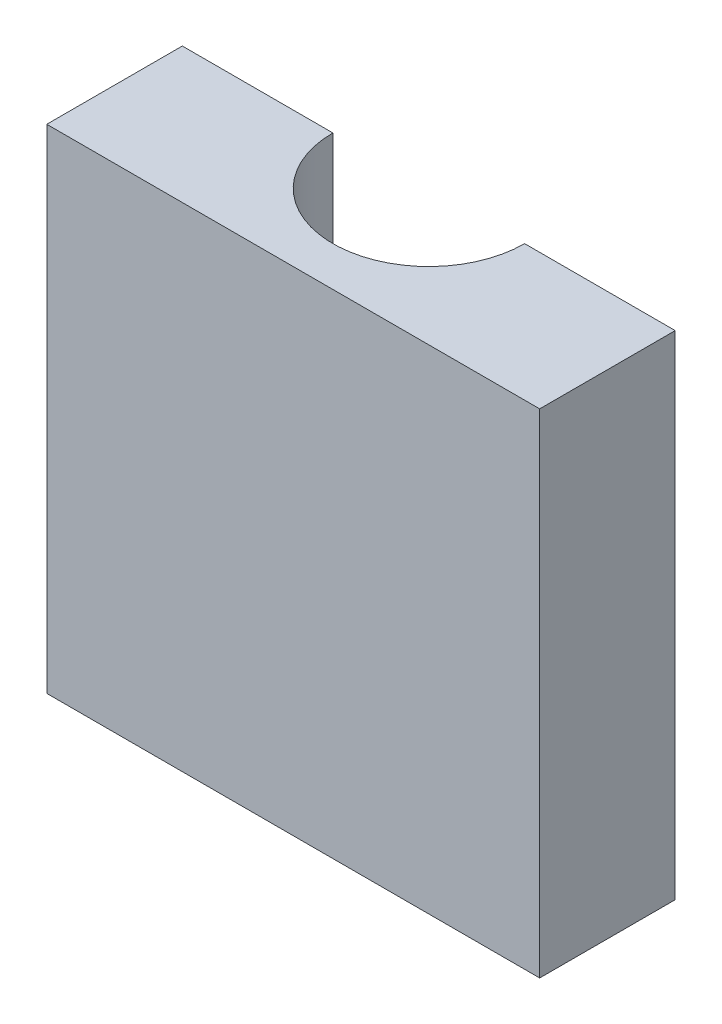
ISO-10303-21;
HEADER;
FILE_DESCRIPTION(('STEP AP214'),'2;1');
FILE_NAME('part.step','',(''),(''),'','','');
FILE_SCHEMA(('AUTOMOTIVE_DESIGN { 1 0 10303 214 1 1 1 1 }'));
ENDSEC;
DATA;
#1=APPLICATION_CONTEXT('core data for automotive mechanical design processes');
#2=APPLICATION_PROTOCOL_DEFINITION('international standard','automotive_design',2000,#1);
#3=PRODUCT_CONTEXT('',#1,'mechanical');
#4=PRODUCT('Part','Part','',(#3));
#5=PRODUCT_RELATED_PRODUCT_CATEGORY('part','',(#4));
#6=PRODUCT_DEFINITION_FORMATION('','',#4);
#7=PRODUCT_DEFINITION_CONTEXT('part definition',#1,'design');
#8=PRODUCT_DEFINITION('design','',#6,#7);
#9=PRODUCT_DEFINITION_SHAPE('','',#8);
#10=(LENGTH_UNIT() NAMED_UNIT(*) SI_UNIT(.MILLI.,.METRE.));
#11=(NAMED_UNIT(*) PLANE_ANGLE_UNIT() SI_UNIT($,.RADIAN.));
#12=(NAMED_UNIT(*) SI_UNIT($,.STERADIAN.) SOLID_ANGLE_UNIT());
#13=UNCERTAINTY_MEASURE_WITH_UNIT(LENGTH_MEASURE(1.E-05),#10,'distance_accuracy_value','');
#14=(GEOMETRIC_REPRESENTATION_CONTEXT(3) GLOBAL_UNCERTAINTY_ASSIGNED_CONTEXT((#13)) GLOBAL_UNIT_ASSIGNED_CONTEXT((#10,
#11,#12)) REPRESENTATION_CONTEXT('',''));
#15=CARTESIAN_POINT('',(0.,0.,0.));
#16=DIRECTION('',(0.,0.,1.));
#17=DIRECTION('',(1.,0.,0.));
#18=AXIS2_PLACEMENT_3D('',#15,#16,#17);
#19=CARTESIAN_POINT('',(25.4,-25.4,13.97));
#20=DIRECTION('',(-1.,0.,0.));
#21=DIRECTION('',(0.,0.,1.));
#22=AXIS2_PLACEMENT_3D('',#19,#20,#21);
#23=PLANE('',#22);
#24=DIRECTION('',(0.,0.,-1.));
#25=VECTOR('',#24,1.);
#26=CARTESIAN_POINT('',(25.4,-25.4,13.97));
#27=LINE('',#26,#25);
#28=CARTESIAN_POINT('',(25.4,-25.4,13.97));
#29=VERTEX_POINT('',#28);
#30=CARTESIAN_POINT('',(25.4,-25.4,0.));
#31=VERTEX_POINT('',#30);
#32=EDGE_CURVE('E236',#29,#31,#27,.T.);
#33=ORIENTED_EDGE('',*,*,#32,.T.);
#34=DIRECTION('',(0.,-1.,0.));
#35=VECTOR('',#34,1.);
#36=CARTESIAN_POINT('',(25.4,0.,0.));
#37=LINE('',#36,#35);
#38=CARTESIAN_POINT('',(25.4,25.4,0.));
#39=VERTEX_POINT('',#38);
#40=EDGE_CURVE('E112',#39,#31,#37,.T.);
#41=ORIENTED_EDGE('',*,*,#40,.F.);
#42=DIRECTION('',(0.,0.,-1.));
#43=VECTOR('',#42,1.);
#44=CARTESIAN_POINT('',(25.4,25.4,13.97));
#45=LINE('',#44,#43);
#46=CARTESIAN_POINT('',(25.4,25.4,13.97));
#47=VERTEX_POINT('',#46);
#48=EDGE_CURVE('E12',#47,#39,#45,.T.);
#49=ORIENTED_EDGE('',*,*,#48,.F.);
#50=DIRECTION('',(0.,1.,0.));
#51=VECTOR('',#50,1.);
#52=CARTESIAN_POINT('',(25.4,-25.4,13.97));
#53=LINE('',#52,#51);
#54=EDGE_CURVE('E183',#29,#47,#53,.T.);
#55=ORIENTED_EDGE('',*,*,#54,.F.);
#56=EDGE_LOOP('',(#33,#41,#49,#55));
#57=FACE_BOUND('',#56,.T.);
#58=ADVANCED_FACE('F45',(#57),#23,.F.);
#59=CARTESIAN_POINT('',(-25.4,25.4,13.97));
#60=DIRECTION('',(0.,-1.,0.));
#61=DIRECTION('',(0.,0.,-1.));
#62=AXIS2_PLACEMENT_3D('',#59,#60,#61);
#63=PLANE('',#62);
#64=ORIENTED_EDGE('',*,*,#48,.T.);
#65=DIRECTION('',(1.,0.,0.));
#66=VECTOR('',#65,1.);
#67=CARTESIAN_POINT('',(0.,25.4,0.));
#68=LINE('',#67,#66);
#69=CARTESIAN_POINT('',(9.8806,25.4,0.));
#70=VERTEX_POINT('',#69);
#71=EDGE_CURVE('E191',#70,#39,#68,.T.);
#72=ORIENTED_EDGE('',*,*,#71,.F.);
#73=CARTESIAN_POINT('',(0.,25.4,0.));
#74=DIRECTION('',(0.,-1.,0.));
#75=DIRECTION('',(0.,0.,-1.));
#76=AXIS2_PLACEMENT_3D('',#73,#74,#75);
#77=CIRCLE('',#76,9.8806);
#78=CARTESIAN_POINT('',(-9.8806,25.4,0.));
#79=VERTEX_POINT('',#78);
#80=EDGE_CURVE('E126',#79,#70,#77,.F.);
#81=ORIENTED_EDGE('',*,*,#80,.F.);
#82=CARTESIAN_POINT('',(-25.4,25.4,0.));
#83=VERTEX_POINT('',#82);
#84=EDGE_CURVE('E62',#83,#79,#68,.T.);
#85=ORIENTED_EDGE('',*,*,#84,.F.);
#86=DIRECTION('',(0.,0.,-1.));
#87=VECTOR('',#86,1.);
#88=CARTESIAN_POINT('',(-25.4,25.4,13.97));
#89=LINE('',#88,#87);
#90=CARTESIAN_POINT('',(-25.4,25.4,13.97));
#91=VERTEX_POINT('',#90);
#92=EDGE_CURVE('E54',#91,#83,#89,.T.);
#93=ORIENTED_EDGE('',*,*,#92,.F.);
#94=DIRECTION('',(-1.,0.,0.));
#95=VECTOR('',#94,1.);
#96=CARTESIAN_POINT('',(-25.4,25.4,13.97));
#97=LINE('',#96,#95);
#98=EDGE_CURVE('E185',#47,#91,#97,.T.);
#99=ORIENTED_EDGE('',*,*,#98,.F.);
#100=EDGE_LOOP('',(#64,#72,#81,#85,#93,#99));
#101=FACE_BOUND('',#100,.T.);
#102=ADVANCED_FACE('F188',(#101),#63,.F.);
#103=CARTESIAN_POINT('',(-25.4,-25.4,13.97));
#104=DIRECTION('',(1.,0.,0.));
#105=DIRECTION('',(0.,0.,-1.));
#106=AXIS2_PLACEMENT_3D('',#103,#104,#105);
#107=PLANE('',#106);
#108=ORIENTED_EDGE('',*,*,#92,.T.);
#109=DIRECTION('',(0.,1.,0.));
#110=VECTOR('',#109,1.);
#111=CARTESIAN_POINT('',(-25.4,0.,0.));
#112=LINE('',#111,#110);
#113=CARTESIAN_POINT('',(-25.4,-25.4,0.));
#114=VERTEX_POINT('',#113);
#115=EDGE_CURVE('E139',#114,#83,#112,.T.);
#116=ORIENTED_EDGE('',*,*,#115,.F.);
#117=DIRECTION('',(0.,0.,-1.));
#118=VECTOR('',#117,1.);
#119=CARTESIAN_POINT('',(-25.4,-25.4,13.97));
#120=LINE('',#119,#118);
#121=CARTESIAN_POINT('',(-25.4,-25.4,13.97));
#122=VERTEX_POINT('',#121);
#123=EDGE_CURVE('E238',#122,#114,#120,.T.);
#124=ORIENTED_EDGE('',*,*,#123,.F.);
#125=DIRECTION('',(0.,-1.,0.));
#126=VECTOR('',#125,1.);
#127=CARTESIAN_POINT('',(-25.4,-25.4,13.97));
#128=LINE('',#127,#126);
#129=EDGE_CURVE('E242',#91,#122,#128,.T.);
#130=ORIENTED_EDGE('',*,*,#129,.F.);
#131=EDGE_LOOP('',(#108,#116,#124,#130));
#132=FACE_BOUND('',#131,.T.);
#133=ADVANCED_FACE('F234',(#132),#107,.F.);
#134=CARTESIAN_POINT('',(-25.4,-25.4,13.97));
#135=DIRECTION('',(0.,1.,0.));
#136=DIRECTION('',(0.,0.,1.));
#137=AXIS2_PLACEMENT_3D('',#134,#135,#136);
#138=PLANE('',#137);
#139=CARTESIAN_POINT('',(0.,-25.4,0.));
#140=DIRECTION('',(0.,1.,0.));
#141=DIRECTION('',(-1.,0.,0.));
#142=AXIS2_PLACEMENT_3D('',#139,#140,#141);
#143=ELLIPSE('',#142,22.098,11.7221);
#144=CARTESIAN_POINT('',(-22.1019589881356,-25.4,-7.46369906238489E-06));
#145=VERTEX_POINT('',#144);
#146=CARTESIAN_POINT('',(22.1019274444897,-25.4,7.32040825024004E-06));
#147=VERTEX_POINT('',#146);
#148=EDGE_CURVE('E48',#145,#147,#143,.T.);
#149=ORIENTED_EDGE('',*,*,#148,.T.);
#150=DIRECTION('',(-1.,0.,0.));
#151=VECTOR('',#150,1.);
#152=CARTESIAN_POINT('',(0.,-25.4,0.));
#153=LINE('',#152,#151);
#154=EDGE_CURVE('E180',#31,#147,#153,.T.);
#155=ORIENTED_EDGE('',*,*,#154,.F.);
#156=ORIENTED_EDGE('',*,*,#32,.F.);
#157=DIRECTION('',(1.,0.,0.));
#158=VECTOR('',#157,1.);
#159=CARTESIAN_POINT('',(-25.4,-25.4,13.97));
#160=LINE('',#159,#158);
#161=EDGE_CURVE('E239',#122,#29,#160,.T.);
#162=ORIENTED_EDGE('',*,*,#161,.F.);
#163=ORIENTED_EDGE('',*,*,#123,.T.);
#164=EDGE_CURVE('E121',#145,#114,#153,.T.);
#165=ORIENTED_EDGE('',*,*,#164,.F.);
#166=EDGE_LOOP('',(#149,#155,#156,#162,#163,#165));
#167=FACE_BOUND('',#166,.T.);
#168=ADVANCED_FACE('F178',(#167),#138,.F.);
#169=CARTESIAN_POINT('',(0.,0.,13.97));
#170=DIRECTION('',(0.,0.,-1.));
#171=DIRECTION('',(-1.,0.,0.));
#172=AXIS2_PLACEMENT_3D('',#169,#170,#171);
#173=PLANE('',#172);
#174=ORIENTED_EDGE('',*,*,#54,.T.);
#175=ORIENTED_EDGE('',*,*,#98,.T.);
#176=ORIENTED_EDGE('',*,*,#129,.T.);
#177=ORIENTED_EDGE('',*,*,#161,.T.);
#178=EDGE_LOOP('',(#174,#175,#176,#177));
#179=FACE_BOUND('',#178,.T.);
#180=ADVANCED_FACE('F157',(#179),#173,.F.);
#181=CARTESIAN_POINT('',(9.77225838475019,12.7,1.4591855336727));
#182=CARTESIAN_POINT('',(14.1336856477358,8.73910093015792,1.4729798232886));
#183=CARTESIAN_POINT('',(25.087132150054,-1.20844455129475,1.50762330218542));
#184=CARTESIAN_POINT('',(23.075398835537,-16.3109737355857,1.62700901527332));
#185=CARTESIAN_POINT('',(21.8646945416059,-25.4,1.69885790022568));
#186=CARTESIAN_POINT('',(9.73199106483536,12.7,1.72885833784222));
#187=CARTESIAN_POINT('',(14.0823470325882,8.73910093015792,1.77282250676437));
#188=CARTESIAN_POINT('',(25.0079886827946,-1.20844455129475,1.88323571401753));
#189=CARTESIAN_POINT('',(22.9904900126863,-16.3109737355857,1.96794372238463));
#190=CARTESIAN_POINT('',(21.7763160039971,-25.4,2.01892282022048));
#191=CARTESIAN_POINT('',(9.6303199498135,12.7,2.25986148159423));
#192=CARTESIAN_POINT('',(13.9489701574063,8.73910093015792,2.36356692769036));
#193=CARTESIAN_POINT('',(24.7949848124144,-1.20844455129475,2.62401654368039));
#194=CARTESIAN_POINT('',(22.7705710304402,-16.3109737355857,2.63975404853283));
#195=CARTESIAN_POINT('',(21.5522353589856,-25.4,2.64922521678516));
#196=CARTESIAN_POINT('',(9.41730371199797,12.7,3.029192440976));
#197=CARTESIAN_POINT('',(13.6609354377259,8.73910093015792,3.22043564480291));
#198=CARTESIAN_POINT('',(24.3185459584344,-1.20844455129475,3.70073075824613));
#199=CARTESIAN_POINT('',(22.2971408365105,-16.3109737355857,3.61452250132493));
#200=CARTESIAN_POINT('',(21.0806158412602,-25.4,3.56264052170384));
#201=CARTESIAN_POINT('',(9.14667776919352,12.7,3.76920328162636));
#202=CARTESIAN_POINT('',(13.28906083889,8.73910093015792,4.0456313714392));
#203=CARTESIAN_POINT('',(23.6923918152202,-1.20844455129475,4.73986289495893));
#204=CARTESIAN_POINT('',(21.6869112110936,-16.3109737355857,4.55357414547988));
#205=CARTESIAN_POINT('',(20.4799699325003,-25.4,4.4414615770406));
#206=CARTESIAN_POINT('',(7.19466304419641,12.7,8.02046943822906));
#207=CARTESIAN_POINT('',(10.5795511374568,8.73910093015792,8.79221733120043));
#208=CARTESIAN_POINT('',(19.0804817755802,-1.20844455129475,10.7304129605715));
#209=CARTESIAN_POINT('',(17.2452506041065,-16.3109737355857,9.95696452534493));
#210=CARTESIAN_POINT('',(16.1407690887755,-25.4,9.49148665364798));
#211=CARTESIAN_POINT('',(2.8555793330397,12.7,10.4165355033875));
#212=CARTESIAN_POINT('',(4.38009341359381,8.73910093015792,11.5159060224529));
#213=CARTESIAN_POINT('',(8.20881332945667,-1.20844455129475,14.2769049892373));
#214=CARTESIAN_POINT('',(7.11164681713652,-16.3109737355857,13.0729855454805));
#215=CARTESIAN_POINT('',(6.45134845748915,-25.4,12.3484409800625));
#216=CARTESIAN_POINT('',(-6.8526416170632,12.7,8.96691198645358));
#217=CARTESIAN_POINT('',(-9.66097444454233,8.73910093015792,10.0525786096365));
#218=CARTESIAN_POINT('',(-16.7139232917138,-1.20844455129475,12.7791611156226));
#219=CARTESIAN_POINT('',(-15.8125393419943,-16.3109737355857,11.4566382912233));
#220=CARTESIAN_POINT('',(-15.2700671313236,-25.4,10.6607156653127));
#221=CARTESIAN_POINT('',(-10.5776047830468,12.7,3.9342705497178));
#222=CARTESIAN_POINT('',(-15.1604579506877,8.73910093015792,4.52387384622685));
#223=CARTESIAN_POINT('',(-26.6700014952407,-1.20844455129475,6.00462493445693));
#224=CARTESIAN_POINT('',(-24.7735752925523,-16.3109737355857,5.19168512695285));
#225=CARTESIAN_POINT('',(-23.6322652937815,-25.4,4.70244049967028));
#226=CARTESIAN_POINT('',(-8.96691198645358,12.7,-6.85264161706319));
#227=CARTESIAN_POINT('',(-13.1069133447839,8.73910093015792,-7.46983349280404));
#228=CARTESIAN_POINT('',(-23.5042628048672,-1.20844455129475,-9.01987153882777));
#229=CARTESIAN_POINT('',(-21.3772223785218,-16.3109737355857,-8.44570315749949));
#230=CARTESIAN_POINT('',(-20.0971237894302,-25.4,-8.10015630012164));
#231=CARTESIAN_POINT('',(-3.9342705497178,12.7,-10.5776047830468));
#232=CARTESIAN_POINT('',(-5.94021206449783,8.73910093015792,-11.6784979572102));
#233=CARTESIAN_POINT('',(-10.9780062873645,-1.20844455129475,-14.4433209751945));
#234=CARTESIAN_POINT('',(-9.6587786125955,-16.3109737355857,-13.2525796848424));
#235=CARTESIAN_POINT('',(-8.86483907846835,-25.4,-12.5359660150347));
#236=CARTESIAN_POINT('',(5.77395040038509,12.7,-9.1279812661129));
#237=CARTESIAN_POINT('',(8.10085579363831,8.73910093015792,-10.2151705443939));
#238=CARTESIAN_POINT('',(13.944730333806,-1.20844455129475,-12.9455771015797));
#239=CARTESIAN_POINT('',(13.2654075465353,-16.3109737355857,-11.6362324305852));
#240=CARTESIAN_POINT('',(12.8565765103444,-25.4,-10.8482407002849));
#241=CARTESIAN_POINT('',(9.22381288743033,12.7,-5.56887620142215));
#242=CARTESIAN_POINT('',(13.1666054310856,8.73910093015792,-6.31744816073156));
#243=CARTESIAN_POINT('',(23.0686775264259,-1.20844455129475,-8.19743891032351));
#244=CARTESIAN_POINT('',(21.5239740190549,-16.3109737355857,-7.22340926042368));
#245=CARTESIAN_POINT('',(20.5943382886481,-25.4,-6.63721730792168));
#246=CARTESIAN_POINT('',(9.84877959224607,12.7,-0.932817310645119));
#247=CARTESIAN_POINT('',(14.184201994655,8.73910093015792,-1.18243186054593));
#248=CARTESIAN_POINT('',(25.0723389476097,-1.20844455129475,-1.80932288810995));
#249=CARTESIAN_POINT('',(23.1673832028441,-16.3109737355857,-1.39097046069282));
#250=CARTESIAN_POINT('',(22.0209399425503,-25.4,-1.13919698923144));
#251=CARTESIAN_POINT('',(9.89142515370662,12.7,-0.146029028267609));
#252=CARTESIAN_POINT('',(14.2654141634167,8.73910093015792,-0.31001648551049));
#253=CARTESIAN_POINT('',(25.2504086917424,-1.20844455129475,-0.721860529134752));
#254=CARTESIAN_POINT('',(23.296886873469,-16.3109737355857,-0.399761419383619));
#255=CARTESIAN_POINT('',(22.1212155075853,-25.4,-0.205915260733738));
#256=CARTESIAN_POINT('',(9.87040879667328,12.7,0.651971194397396));
#257=CARTESIAN_POINT('',(14.2550702141331,8.73910093015792,0.575792517391809));
#258=CARTESIAN_POINT('',(25.2668678140884,-1.20844455129475,0.384474626966447));
#259=CARTESIAN_POINT('',(23.2768292420515,-16.3109737355857,0.606973598829173));
#260=CARTESIAN_POINT('',(22.079181309859,-25.4,0.740878256412555));
#261=CARTESIAN_POINT('',(9.81252570466502,12.7,1.18951272950317));
#262=CARTESIAN_POINT('',(14.1850242628834,8.73910093015792,1.17313713981283));
#263=CARTESIAN_POINT('',(25.1662756173133,-1.20844455129475,1.1320108903533));
#264=CARTESIAN_POINT('',(23.1603076583878,-16.3109737355857,1.28607430816201));
#265=CARTESIAN_POINT('',(21.9530730792146,-25.4,1.37879298023088));
#266=CARTESIAN_POINT('',(9.77225838475019,12.7,1.4591855336727));
#267=CARTESIAN_POINT('',(14.1336856477358,8.73910093015792,1.4729798232886));
#268=CARTESIAN_POINT('',(25.087132150054,-1.20844455129475,1.50762330218542));
#269=CARTESIAN_POINT('',(23.075398835537,-16.3109737355857,1.62700901527332));
#270=CARTESIAN_POINT('',(21.8646945416059,-25.4,1.69885790022568));
#271=B_SPLINE_SURFACE_WITH_KNOTS('',3,3,((#181,#182,#183,#184,#185),(#186,#187,#188,#189,#190),
(#191,#192,#193,#194,#195),(#196,#197,#198,#199,#200),(#201,#202,#203,#204,#205),(#206,#207,
#208,#209,#210),(#211,#212,#213,#214,#215),(#216,#217,#218,#219,#220),(#221,#222,#223,#224,
#225),(#226,#227,#228,#229,#230),(#231,#232,#233,#234,#235),(#236,#237,#238,#239,#240),(#241,
#242,#243,#244,#245),(#246,#247,#248,#249,#250),(#251,#252,#253,#254,#255),(#256,#257,#258,#259,
#260),(#261,#262,#263,#264,#265),(#266,#267,#268,#269,#270)),.UNSPECIFIED.,.T.,.F.,.F.,(4,1,1,1,
1,2,2,2,1,1,1,1,4),(4,1,4),(0.,0.0125,0.0249999999999999,0.0375000000000001,0.05,0.25,0.5,0.75,
0.95,0.9625,0.975,0.9875,1.),(0.,0.398178533310275,1.),.UNSPECIFIED.);
#272=CARTESIAN_POINT('',(-9.88172679733598,12.7,-8.19736424387044E-06));
#273=CARTESIAN_POINT('',(-9.88189672015932,12.7,0.164818626537073));
#274=CARTESIAN_POINT('',(-9.87791862704196,12.7,0.329650183013946));
#275=CARTESIAN_POINT('',(-9.86173571738352,12.7,0.657681454126317));
#276=CARTESIAN_POINT('',(-9.84959221870248,12.7,0.820884196430956));
#277=CARTESIAN_POINT('',(-9.81725498491208,12.7,1.14541959489437));
#278=CARTESIAN_POINT('',(-9.7971140584227,12.7,1.30675751224433));
#279=CARTESIAN_POINT('',(-9.74896702130205,12.7,1.62732546048826));
#280=CARTESIAN_POINT('',(-9.72100587618124,12.7,1.78656224652566));
#281=CARTESIAN_POINT('',(-9.65740021826624,12.7,2.10269095908212));
#282=CARTESIAN_POINT('',(-9.62179358300551,12.7,2.25959050803901));
#283=CARTESIAN_POINT('',(-9.54307864555011,12.7,2.57080834609488));
#284=CARTESIAN_POINT('',(-9.50000185367354,12.7,2.7251346065516));
#285=CARTESIAN_POINT('',(-9.40652738382769,12.7,3.03096996689708));
#286=CARTESIAN_POINT('',(-9.35615553818489,12.7,3.18248696349762));
#287=CARTESIAN_POINT('',(-9.24827108423939,12.7,3.48246829061058));
#288=CARTESIAN_POINT('',(-9.19077926759534,12.7,3.6309400997575));
#289=CARTESIAN_POINT('',(-9.06883433547866,12.7,3.92459586525477));
#290=CARTESIAN_POINT('',(-9.00439754700236,12.7,4.06978660253197));
#291=CARTESIAN_POINT('',(-8.86874155668963,12.7,4.35664529388166));
#292=CARTESIAN_POINT('',(-8.79753472515876,12.7,4.49831909851572));
#293=CARTESIAN_POINT('',(-8.64851702260477,12.7,4.77790920615785));
#294=CARTESIAN_POINT('',(-8.57071500238451,12.7,4.91583022689792));
#295=CARTESIAN_POINT('',(-8.40868485850965,12.7,5.18768023282691));
#296=CARTESIAN_POINT('',(-8.32446243286154,12.7,5.32161261436565));
#297=CARTESIAN_POINT('',(-8.14976904756581,12.7,5.58525098140914));
#298=CARTESIAN_POINT('',(-8.05930093231365,12.7,5.71495885173259));
#299=CARTESIAN_POINT('',(-7.87229343849935,12.7,5.96991401370263));
#300=CARTESIAN_POINT('',(-7.77575428758895,12.7,6.09516147233025));
#301=CARTESIAN_POINT('',(-7.57678175639444,12.7,6.34096182492867));
#302=CARTESIAN_POINT('',(-7.47434616871707,12.7,6.46151293207833));
#303=CARTESIAN_POINT('',(-7.26375761558237,12.7,6.69768682450895));
#304=CARTESIAN_POINT('',(-7.15560014311328,12.7,6.81330559120772));
#305=CARTESIAN_POINT('',(-6.93374453479323,12.7,7.03938131845045));
#306=CARTESIAN_POINT('',(-6.82003969199904,12.7,7.1498316976614));
#307=CARTESIAN_POINT('',(-6.58726595456328,12.7,7.3653374934144));
#308=CARTESIAN_POINT('',(-6.46818822911489,12.7,7.47038337231977));
#309=CARTESIAN_POINT('',(-6.22484525702681,12.7,7.67484740266276));
#310=CARTESIAN_POINT('',(-6.10056912185166,12.7,7.77425259631648));
#311=CARTESIAN_POINT('',(-5.84700578820758,12.7,7.96720295425707));
#312=CARTESIAN_POINT('',(-5.71770571488862,12.7,8.06073120096675));
#313=CARTESIAN_POINT('',(-5.45427088287096,12.7,8.24169590195745));
#314=CARTESIAN_POINT('',(-5.32012135632962,12.7,8.32911086064361));
#315=CARTESIAN_POINT('',(-5.04716389186379,12.7,8.49761783977952));
#316=CARTESIAN_POINT('',(-4.90833942614656,12.7,8.57868309038838));
#317=CARTESIAN_POINT('',(-4.62620821167104,12.7,8.73426019997487));
#318=CARTESIAN_POINT('',(-4.48288336652116,12.7,8.80873924520733));
#319=CARTESIAN_POINT('',(-4.19192731561803,12.7,8.95091425921192));
#320=CARTESIAN_POINT('',(-4.04427671326992,12.7,9.01857053651363));
#321=CARTESIAN_POINT('',(-3.74484478592264,12.7,9.14687113911879));
#322=CARTESIAN_POINT('',(-3.59304312757769,12.7,9.20746801152747));
#323=CARTESIAN_POINT('',(-3.28548434506722,12.7,9.32142185716532));
#324=CARTESIAN_POINT('',(-3.12970642548521,12.7,9.37472270305863));
#325=CARTESIAN_POINT('',(-2.81436988607316,12.7,9.47385721999038));
#326=CARTESIAN_POINT('',(-2.65479060770308,12.7,9.51962516971486));
#327=CARTESIAN_POINT('',(-2.33202549552964,12.7,9.60346834545155));
#328=CARTESIAN_POINT('',(-2.16881987166267,12.7,9.64146737204265));
#329=CARTESIAN_POINT('',(-1.8389754837353,12.7,9.70954484077519));
#330=CARTESIAN_POINT('',(-1.6723186650728,12.7,9.73953574266796));
#331=CARTESIAN_POINT('',(-1.3373826285795,12.7,9.79112952798857));
#332=CARTESIAN_POINT('',(-1.16910090122854,12.7,9.81271611890582));
#333=CARTESIAN_POINT('',(-0.83343091724891,12.7,9.84710760153113));
#334=CARTESIAN_POINT('',(-0.666051896808983,12.7,9.86000252449669));
#335=CARTESIAN_POINT('',(-0.332445268143639,12.7,9.87718948154195));
#336=CARTESIAN_POINT('',(-0.166221812657699,12.7,9.88156201828668));
#337=CARTESIAN_POINT('',(0.164833030197427,12.7,9.88189021586994));
#338=CARTESIAN_POINT('',(0.329664344906685,12.7,9.87791649148423));
#339=CARTESIAN_POINT('',(0.65769537882489,12.7,9.86173645692129));
#340=CARTESIAN_POINT('',(0.820898123909287,12.7,9.84959150767346));
#341=CARTESIAN_POINT('',(1.1454334541076,12.7,9.81725293152923));
#342=CARTESIAN_POINT('',(1.30677130089855,12.7,9.79711210297808));
#343=CARTESIAN_POINT('',(1.62733911902386,12.7,9.74896485502147));
#344=CARTESIAN_POINT('',(1.78657584543506,12.7,9.72100340322478));
#345=CARTESIAN_POINT('',(2.10270442726547,12.7,9.65739724652296));
#346=CARTESIAN_POINT('',(2.25960390516215,12.7,9.62179041843157));
#347=CARTESIAN_POINT('',(2.57082159561295,12.7,9.54307507140975));
#348=CARTESIAN_POINT('',(2.72514777952314,12.7,9.49999806274516));
#349=CARTESIAN_POINT('',(3.03098297971513,12.7,9.4065231722121));
#350=CARTESIAN_POINT('',(3.18249989270248,12.7,9.35615112249074));
#351=CARTESIAN_POINT('',(3.48248104596159,12.7,9.24826626345723));
#352=CARTESIAN_POINT('',(3.63095276485142,12.7,9.19077424567428));
#353=CARTESIAN_POINT('',(3.92460834310246,12.7,9.06882891694299));
#354=CARTESIAN_POINT('',(4.06979898336717,12.7,9.00439193286986));
#355=CARTESIAN_POINT('',(4.35665747399652,12.7,8.86873555631445));
#356=CARTESIAN_POINT('',(4.49833117489316,12.7,8.79752853403164));
#357=CARTESIAN_POINT('',(4.77792106836263,12.7,8.64851045509717));
#358=CARTESIAN_POINT('',(4.91584197863242,12.7,8.57070824915342));
#359=CARTESIAN_POINT('',(5.1876917569302,12.7,8.40867773889383));
#360=CARTESIAN_POINT('',(5.32162402126763,12.7,8.32445513249908));
#361=CARTESIAN_POINT('',(5.58526214722224,12.7,8.14976139077614));
#362=CARTESIAN_POINT('',(5.71496989361213,12.7,8.05929309976564));
#363=CARTESIAN_POINT('',(5.96992480103422,12.7,7.87228525948944));
#364=CARTESIAN_POINT('',(6.09517212899523,12.7,7.77574593780362));
#365=CARTESIAN_POINT('',(6.34097221358551,12.7,7.57677307010859));
#366=CARTESIAN_POINT('',(6.46152318333413,12.7,7.47433731663874));
#367=CARTESIAN_POINT('',(6.69769679429512,12.7,7.26374843696274));
#368=CARTESIAN_POINT('',(6.81331541685716,12.7,7.15559080368076));
#369=CARTESIAN_POINT('',(7.03939084916643,12.7,6.93373487878226));
#370=CARTESIAN_POINT('',(7.14984107750222,12.7,6.8200298801609));
#371=CARTESIAN_POINT('',(7.36534656485871,12.7,6.58725583608948));
#372=CARTESIAN_POINT('',(7.4703922861521,12.7,6.4681779597729));
#373=CARTESIAN_POINT('',(7.67485599462372,12.7,6.22483469106258));
#374=CARTESIAN_POINT('',(7.7742610239131,12.7,6.10055841007578));
#375=CARTESIAN_POINT('',(7.96721104654195,12.7,5.84699478955505));
#376=CARTESIAN_POINT('',(8.0607391221829,12.7,5.71769457511478));
#377=CARTESIAN_POINT('',(8.24170347428195,12.7,5.45425946696791));
#378=CARTESIAN_POINT('',(8.32911825500448,12.7,5.32010980536993));
#379=CARTESIAN_POINT('',(8.49762487218136,12.7,5.04715207176466));
#380=CARTESIAN_POINT('',(8.57868993863586,12.7,4.90832747190053));
#381=CARTESIAN_POINT('',(8.73426667126074,12.7,4.62619600938413));
#382=CARTESIAN_POINT('',(8.80874552349196,12.7,4.48287105037101));
#383=CARTESIAN_POINT('',(8.9509201527941,12.7,4.1919147195054));
#384=CARTESIAN_POINT('',(9.01857623822924,12.7,4.04426395070937));
#385=CARTESIAN_POINT('',(9.14687642105731,12.7,3.74483191097723));
#386=CARTESIAN_POINT('',(9.20747306513254,12.7,3.59303030805056));
#387=CARTESIAN_POINT('',(9.32142655888543,12.7,3.28547082915088));
#388=CARTESIAN_POINT('',(9.37472728178073,12.7,3.12969215181304));
#389=CARTESIAN_POINT('',(9.4738611262609,12.7,2.8143571674149));
#390=CARTESIAN_POINT('',(9.51962852274947,12.7,2.6547802273434));
#391=CARTESIAN_POINT('',(9.60347217312437,12.7,2.33200820894106));
#392=CARTESIAN_POINT('',(9.64147224220167,12.7,2.16879323165413));
#393=CARTESIAN_POINT('',(9.68462405734521,12.7,1.95972082861558));
#394=CARTESIAN_POINT('',(9.69360523399736,12.7,1.91463239809046));
#395=CARTESIAN_POINT('',(9.71097009686242,12.7,1.82420233964608));
#396=CARTESIAN_POINT('',(9.71935194653138,12.7,1.77886035709543));
#397=CARTESIAN_POINT('',(9.74363107923558,12.7,1.64225096339833));
#398=CARTESIAN_POINT('',(9.75857666292193,12.7,1.55081324736814));
#399=CARTESIAN_POINT('',(9.79048680062489,12.7,1.33710820365137));
#400=CARTESIAN_POINT('',(9.80647176878913,12.7,1.2146936138066));
#401=CARTESIAN_POINT('',(9.83379022582391,12.7,0.970325027928238));
#402=CARTESIAN_POINT('',(9.8451594120976,12.7,0.848375015810071));
#403=CARTESIAN_POINT('',(9.86331620821015,12.7,0.605026567425664));
#404=CARTESIAN_POINT('',(9.87013656955124,12.7,0.483630578891101));
#405=CARTESIAN_POINT('',(9.87926812659709,12.7,0.241483225536023));
#406=CARTESIAN_POINT('',(9.88160920440965,12.7,0.120732986062741));
#407=CARTESIAN_POINT('',(9.88172682543823,12.7,-2.01422347354251E-05));
#408=B_SPLINE_CURVE_WITH_KNOTS('',3,(#272,#273,#274,#275,#276,#277,#278,#279,#280,#281,#282,
#283,#284,#285,#286,#287,#288,#289,#290,#291,#292,#293,#294,#295,#296,#297,#298,#299,#300,#301,
#302,#303,#304,#305,#306,#307,#308,#309,#310,#311,#312,#313,#314,#315,#316,#317,#318,#319,#320,
#321,#322,#323,#324,#325,#326,#327,#328,#329,#330,#331,#332,#333,#334,#335,#336,#337,#338,#339,
#340,#341,#342,#343,#344,#345,#346,#347,#348,#349,#350,#351,#352,#353,#354,#355,#356,#357,#358,
#359,#360,#361,#362,#363,#364,#365,#366,#367,#368,#369,#370,#371,#372,#373,#374,#375,#376,#377,
#378,#379,#380,#381,#382,#383,#384,#385,#386,#387,#388,#389,#390,#391,#392,#393,#394,#395,#396,
#397,#398,#399,#400,#401,#402,#403,#404,#405,#406,#407),.UNSPECIFIED.,.F.,.F.,(4,2,2,2,2,2,2,2,
2,2,2,2,2,2,2,2,2,2,2,2,2,2,2,2,2,2,2,2,2,2,2,2,2,2,2,2,2,2,2,2,2,2,2,2,2,2,2,2,2,2,2,2,2,2,2,2,
2,2,2,2,2,2,2,2,2,2,2,4),(0.,0.494429287991037,0.985186536049581,1.47275571425862,
1.95757709921612,2.44004981368581,2.92053479942982,3.39935816717145,3.8768148681187,
4.3531726338477,4.82867613498341,5.30355131342605,5.77800984731805,6.25225371207167,
6.72647980421639,7.20088459730642,7.67566880047273,8.15104199031679,8.62722718571885,
9.10446533284758,9.5830196643753,10.063179892878,10.5452661939799,11.0296329304285,
11.5166720644839,12.0068162033599,12.5005412215853,12.9983684056558,13.5008660707202,
14.0086506066483,14.5174146843603,15.0208243169941,15.5194552329681,16.0138844088222,
16.5046415592006,16.9922106529074,17.4770319653278,17.9595046180913,18.4399895519166,
18.9188128765839,19.396269542467,19.8726272804235,20.3481307604814,20.8230059240695,
21.297464448988,21.7717083104379,22.24593440487,22.7203392058932,23.1951234228254,
23.670496632587,24.1466818545062,24.6239200353264,25.1024744084166,25.5826346871665,
26.0647210481242,26.5490878550633,27.0361270713623,27.5262713054344,28.0199964330765,
28.5178237421059,29.0203215490314,29.1582418251756,29.2965680730885,29.5744856606061,
29.9447605008459,30.3121145182146,30.6767941838238,31.0390324054906),.UNSPECIFIED.);
#409=CARTESIAN_POINT('',(9.88116341270768,12.7,-2.07001184650048E-05));
#410=VERTEX_POINT('',#409);
#411=CARTESIAN_POINT('',(-9.88116340176562,12.7,-1.11817730899691E-06));
#412=VERTEX_POINT('',#411);
#413=EDGE_CURVE('E118',#410,#412,#408,.F.);
#414=CARTESIAN_POINT('',(22.1004588175771,-25.4,7.23850639801002E-13));
#415=CARTESIAN_POINT('',(22.1662759105087,-24.8927848426811,2.60085997615544E-13));
#416=CARTESIAN_POINT('',(22.2321200269299,-24.385568953275,0.));
#417=CARTESIAN_POINT('',(22.3623901431484,-23.3703769561709,0.));
#418=CARTESIAN_POINT('',(22.4268144676026,-22.8624006343544,0.));
#419=CARTESIAN_POINT('',(22.552658581547,-21.8457400423585,0.));
#420=CARTESIAN_POINT('',(22.6140764099069,-21.3370555269454,0.));
#421=CARTESIAN_POINT('',(22.7322591791266,-20.3190267520731,0.));
#422=CARTESIAN_POINT('',(22.7890230811743,-19.8096823709572,0.));
#423=CARTESIAN_POINT('',(22.8981927233643,-18.7711945916502,0.));
#424=CARTESIAN_POINT('',(22.9503550658299,-18.2420253000457,0.));
#425=CARTESIAN_POINT('',(23.0457808193285,-17.183027603297,0.));
#426=CARTESIAN_POINT('',(23.0890468083784,-16.6531994339854,0.));
#427=CARTESIAN_POINT('',(23.164489940578,-15.5928934103017,0.));
#428=CARTESIAN_POINT('',(23.1966702763482,-15.062415787211,0.));
#429=CARTESIAN_POINT('',(23.2475601114391,-14.000795369967,0.));
#430=CARTESIAN_POINT('',(23.2662698071004,-13.4696525856217,0.));
#431=CARTESIAN_POINT('',(23.285025293931,-12.5342928261733,0.));
#432=CARTESIAN_POINT('',(23.2884680107202,-12.1301450918061,0.));
#433=CARTESIAN_POINT('',(23.2847720579238,-11.3218468757773,0.));
#434=CARTESIAN_POINT('',(23.2776323924588,-10.9176963974368,0.));
#435=CARTESIAN_POINT('',(23.2514225745935,-10.1097595597073,0.));
#436=CARTESIAN_POINT('',(23.2323521361705,-9.7059732092802,0.));
#437=CARTESIAN_POINT('',(23.180842082836,-8.89913044297491,0.));
#438=CARTESIAN_POINT('',(23.1483989581254,-8.49607424664811,0.));
#439=CARTESIAN_POINT('',(23.0692841441595,-7.69790587192157,0.));
#440=CARTESIAN_POINT('',(23.0228503360333,-7.30277040038677,0.));
#441=CARTESIAN_POINT('',(22.9141110871187,-6.51464823502059,0.));
#442=CARTESIAN_POINT('',(22.851804905327,-6.12166164238501,0.));
#443=CARTESIAN_POINT('',(22.7098656934211,-5.33891317182155,0.));
#444=CARTESIAN_POINT('',(22.6302371573971,-4.94915048466169,0.));
#445=CARTESIAN_POINT('',(22.4522210132689,-4.17390918944622,0.));
#446=CARTESIAN_POINT('',(22.3538339499144,-3.78843045732799,0.));
#447=CARTESIAN_POINT('',(22.1566772125551,-3.09254449640839,0.));
#448=CARTESIAN_POINT('',(22.0612124571912,-2.78120024028797,0.));
#449=CARTESIAN_POINT('',(21.8562439446828,-2.16314552827177,0.));
#450=CARTESIAN_POINT('',(21.7467398178641,-1.85643519463076,0.));
#451=CARTESIAN_POINT('',(21.5132476018454,-1.24866738129835,0.));
#452=CARTESIAN_POINT('',(21.3892643181544,-0.947608064370391,0.));
#453=CARTESIAN_POINT('',(21.1922309972549,-0.500990738423181,0.));
#454=CARTESIAN_POINT('',(21.1247213201023,-0.352969147860945,0.));
#455=CARTESIAN_POINT('',(20.9859695744178,-0.0586858232820205,0.));
#456=CARTESIAN_POINT('',(20.9147275194754,0.0875759171398952,0.));
#457=CARTESIAN_POINT('',(20.6936634242476,0.527366641439175,0.));
#458=CARTESIAN_POINT('',(20.5381917397535,0.818073935972209,0.));
#459=CARTESIAN_POINT('',(20.2138458016279,1.39201501106897,0.));
#460=CARTESIAN_POINT('',(20.0449664432771,1.67524588991179,0.));
#461=CARTESIAN_POINT('',(19.6952500507413,2.23435370331465,0.));
#462=CARTESIAN_POINT('',(19.5144087053192,2.51022793563626,0.));
#463=CARTESIAN_POINT('',(19.1422623517539,3.05473274571886,0.));
#464=CARTESIAN_POINT('',(18.9509590863697,3.32336451887345,0.));
#465=CARTESIAN_POINT('',(18.4991700673828,3.93503067552515,0.));
#466=CARTESIAN_POINT('',(18.2354350441556,4.27566418777598,0.));
#467=CARTESIAN_POINT('',(17.694940500299,4.94627436447998,0.));
#468=CARTESIAN_POINT('',(17.4181834074081,5.27625299615886,0.));
#469=CARTESIAN_POINT('',(16.8536812601919,5.92701169200513,0.));
#470=CARTESIAN_POINT('',(16.5659292961923,6.24778574230886,0.));
#471=CARTESIAN_POINT('',(15.9813204500555,6.88143310790821,0.));
#472=CARTESIAN_POINT('',(15.684455594486,7.19429904078214,0.));
#473=CARTESIAN_POINT('',(15.0833717100597,7.81331400204969,0.));
#474=CARTESIAN_POINT('',(14.7791473930866,8.119457879687,0.));
#475=CARTESIAN_POINT('',(14.1736918152509,8.71752361306551,0.));
#476=CARTESIAN_POINT('',(13.8726161688181,9.00960347865095,0.));
#477=CARTESIAN_POINT('',(13.2665175482504,9.58937495922014,0.));
#478=CARTESIAN_POINT('',(12.9614962585041,9.87706833948694,0.));
#479=CARTESIAN_POINT('',(12.3489076665623,10.448919607109,0.));
#480=CARTESIAN_POINT('',(12.0413441992674,10.7330816124117,0.));
#481=CARTESIAN_POINT('',(11.4250307118323,11.2986761932144,0.));
#482=CARTESIAN_POINT('',(11.116285074412,11.5801135577026,0.));
#483=CARTESIAN_POINT('',(10.49892487626,12.1410246554287,0.));
#484=CARTESIAN_POINT('',(10.1903134287772,12.4205018113309,0.));
#485=CARTESIAN_POINT('',(9.88172680547307,12.7,0.));
#486=B_SPLINE_CURVE_WITH_KNOTS('',3,(#414,#415,#416,#417,#418,#419,#420,#421,#422,#423,#424,
#425,#426,#427,#428,#429,#430,#431,#432,#433,#434,#435,#436,#437,#438,#439,#440,#441,#442,#443,
#444,#445,#446,#447,#448,#449,#450,#451,#452,#453,#454,#455,#456,#457,#458,#459,#460,#461,#462,
#463,#464,#465,#466,#467,#468,#469,#470,#471,#472,#473,#474,#475,#476,#477,#478,#479,#480,#481,
#482,#483,#484,#485),.UNSPECIFIED.,.F.,.F.,(4,2,2,2,2,2,2,2,2,2,2,2,2,2,2,2,2,2,2,2,2,2,2,2,2,2,
2,2,2,2,2,2,2,2,2,4),(0.,1.53440991864325,3.07054274471551,4.60766458688766,6.14512860419795,
7.74027292557319,9.33495434690654,10.9291761221639,12.5233746604605,13.7357440288511,
14.9482274972805,16.1607400343159,17.3735710105696,18.5668443086869,19.7601733250956,
20.9531931141276,22.1461782629965,23.1228223053257,24.0994920691978,25.0758386010102,
25.563862715444,26.0518850531066,27.0404639248694,28.029421001209,29.018736471833,
30.0078876401581,31.2998779716046,32.5916283809791,33.884204385607,35.1779455278789,
36.4726456460775,37.7310105549368,38.9888549229756,40.2450604784421,41.4983639131989,
42.747412609627),.UNSPECIFIED.);
#487=EDGE_CURVE('E70',#147,#410,#486,.T.);
#488=CARTESIAN_POINT('',(-9.88172680545381,12.7,-9.70814056856957E-09));
#489=CARTESIAN_POINT('',(-10.1465933515126,12.4601027241142,-3.49234404019179E-09));
#490=CARTESIAN_POINT('',(-10.4114760546887,12.2202203554792,-9.37383055662508E-10));
#491=CARTESIAN_POINT('',(-10.9416008886766,11.7389797343626,9.40684168642178E-10));
#492=CARTESIAN_POINT('',(-11.2068410002221,11.4976192593553,2.52377336956557E-10));
#493=CARTESIAN_POINT('',(-11.7368275399723,11.0129625568146,-2.53039015656306E-10));
#494=CARTESIAN_POINT('',(-12.0015708506526,10.7696629132087,-6.78597147326744E-11));
#495=CARTESIAN_POINT('',(-12.5296864390919,10.2806442259311,6.79796547846522E-11));
#496=CARTESIAN_POINT('',(-12.793055466545,10.0349216660975,1.82246390343843E-11));
#497=CARTESIAN_POINT('',(-13.3175219767635,9.54054760407482,-1.82424807986519E-11));
#498=CARTESIAN_POINT('',(-13.578616983287,9.29189346998287,-4.89281872878909E-12));
#499=CARTESIAN_POINT('',(-14.0976069952452,8.79111691198116,4.89419006884698E-12));
#500=CARTESIAN_POINT('',(-14.3555010832859,8.53899353552566,1.3267956304787E-12));
#501=CARTESIAN_POINT('',(-14.8737839129311,8.02409391719795,-1.36090365679178E-12));
#502=CARTESIAN_POINT('',(-15.1340663545871,7.76121043796823,-3.64529343811672E-13));
#503=CARTESIAN_POINT('',(-15.6491984737874,7.23050149339569,3.642867851835E-13));
#504=CARTESIAN_POINT('',(-15.9040516510623,6.96267943285564,0.));
#505=CARTESIAN_POINT('',(-16.4072047521804,6.42137091632147,0.));
#506=CARTESIAN_POINT('',(-16.6555102135185,6.14788962023867,0.));
#507=CARTESIAN_POINT('',(-17.1443850404908,5.59448486497977,0.));
#508=CARTESIAN_POINT('',(-17.3849606674525,5.31456695196006,0.));
#509=CARTESIAN_POINT('',(-17.8571195553045,4.7474469438531,0.));
#510=CARTESIAN_POINT('',(-18.0887069455094,4.46024829633497,0.));
#511=CARTESIAN_POINT('',(-18.5415495533399,3.87764647796922,0.));
#512=CARTESIAN_POINT('',(-18.762801520489,3.58224077197743,0.));
#513=CARTESIAN_POINT('',(-19.1784007508254,3.00329236511582,0.));
#514=CARTESIAN_POINT('',(-19.3735521881284,2.72032839201165,0.));
#515=CARTESIAN_POINT('',(-19.7518596026585,2.14639265757871,0.));
#516=CARTESIAN_POINT('',(-19.9350132323582,1.85541934484185,0.));
#517=CARTESIAN_POINT('',(-20.2875844501974,1.26538212170251,0.));
#518=CARTESIAN_POINT('',(-20.4570076505137,0.966321584217027,0.));
#519=CARTESIAN_POINT('',(-20.699585636723,0.511663721700708,0.));
#520=CARTESIAN_POINT('',(-20.7785068408262,0.359125423130608,0.));
#521=CARTESIAN_POINT('',(-20.9322776900265,0.0520109027879274,0.));
#522=CARTESIAN_POINT('',(-21.0071273623776,-0.102565305334609,0.));
#523=CARTESIAN_POINT('',(-21.2236054573542,-0.565275971098447,0.));
#524=CARTESIAN_POINT('',(-21.3592216378001,-0.876246304841602,0.));
#525=CARTESIAN_POINT('',(-21.6146201464474,-1.50477566730709,0.));
#526=CARTESIAN_POINT('',(-21.7343942752401,-1.82233801026429,0.));
#527=CARTESIAN_POINT('',(-21.9585416343308,-2.46299997962654,0.));
#528=CARTESIAN_POINT('',(-22.0629081299645,-2.78610195893731,0.));
#529=CARTESIAN_POINT('',(-22.2568170182,-3.43669984087004,0.));
#530=CARTESIAN_POINT('',(-22.3463594673324,-3.76419572673099,0.));
#531=CARTESIAN_POINT('',(-22.5387238822107,-4.53178255905809,0.));
#532=CARTESIAN_POINT('',(-22.6361201252677,-4.97323703281803,0.));
#533=CARTESIAN_POINT('',(-22.8080231541618,-5.86053051302346,0.));
#534=CARTESIAN_POINT('',(-22.8825295183275,-6.30636960008503,0.));
#535=CARTESIAN_POINT('',(-23.0108357874431,-7.20114296893147,0.));
#536=CARTESIAN_POINT('',(-23.0646285231967,-7.65007826772142,0.));
#537=CARTESIAN_POINT('',(-23.1536318715102,-8.54973790030621,0.));
#538=CARTESIAN_POINT('',(-23.1888431829888,-9.00046216616854,0.));
#539=CARTESIAN_POINT('',(-23.2432265517504,-9.91030250179627,0.));
#540=CARTESIAN_POINT('',(-23.2621249205613,-10.3694345317711,0.));
#541=CARTESIAN_POINT('',(-23.2849673192965,-11.2878927940589,0.));
#542=CARTESIAN_POINT('',(-23.2889163961866,-11.7472189084623,0.));
#543=CARTESIAN_POINT('',(-23.2838101556138,-12.6657695272273,0.));
#544=CARTESIAN_POINT('',(-23.274755175343,-13.1249940339149,0.));
#545=CARTESIAN_POINT('',(-23.2454313943253,-14.0430432259914,0.));
#546=CARTESIAN_POINT('',(-23.2251632733092,-14.5018679339274,0.));
#547=CARTESIAN_POINT('',(-23.1758904174235,-15.4038144095276,0.));
#548=CARTESIAN_POINT('',(-23.1471968631564,-15.8469535531246,0.));
#549=CARTESIAN_POINT('',(-23.0822457293939,-16.7326337042592,0.));
#550=CARTESIAN_POINT('',(-23.0459887657498,-17.1751747575454,0.));
#551=CARTESIAN_POINT('',(-22.9671852188014,-18.0597222775025,0.));
#552=CARTESIAN_POINT('',(-22.924638188443,-18.5017287039228,0.));
#553=CARTESIAN_POINT('',(-22.8344471375918,-19.3852634198128,0.));
#554=CARTESIAN_POINT('',(-22.7868025855749,-19.8267916545628,0.));
#555=CARTESIAN_POINT('',(-22.6890027415051,-20.6964573236845,0.));
#556=CARTESIAN_POINT('',(-22.6389620509295,-21.1246077442859,0.));
#557=CARTESIAN_POINT('',(-22.5361293483501,-21.980546462056,0.));
#558=CARTESIAN_POINT('',(-22.483337524318,-22.4083347819411,0.));
#559=CARTESIAN_POINT('',(-22.37595935889,-23.2635834766702,0.));
#560=CARTESIAN_POINT('',(-22.3213734377076,-23.6910439046463,0.));
#561=CARTESIAN_POINT('',(-22.2113388001523,-24.5456693936717,0.));
#562=CARTESIAN_POINT('',(-22.1558904602123,-24.9728345030504,0.));
#563=CARTESIAN_POINT('',(-22.1004588175771,-25.4,0.));
#564=B_SPLINE_CURVE_WITH_KNOTS('',3,(#488,#489,#490,#491,#492,#493,#494,#495,#496,#497,#498,
#499,#500,#501,#502,#503,#504,#505,#506,#507,#508,#509,#510,#511,#512,#513,#514,#515,#516,#517,
#518,#519,#520,#521,#522,#523,#524,#525,#526,#527,#528,#529,#530,#531,#532,#533,#534,#535,#536,
#537,#538,#539,#540,#541,#542,#543,#544,#545,#546,#547,#548,#549,#550,#551,#552,#553,#554,#555,
#556,#557,#558,#559,#560,#561,#562,#563),.UNSPECIFIED.,.F.,.F.,(4,2,2,2,2,2,2,2,2,2,2,2,2,2,2,2,
2,2,2,2,2,2,2,2,2,2,2,2,2,2,2,2,2,2,2,2,2,4),(0.,1.07207839576554,2.14793225118559,
3.22660676232996,4.30718779897983,5.3888267151351,6.47076878880675,7.5805244216056,
8.68954162056237,9.79758869817539,10.9047143679842,12.0113252391467,13.118281826559,
14.149210042747,15.1803393746681,16.2110450944213,16.7262291018558,17.2414096603074,
18.2586800676202,19.2764749427357,20.2947133863133,21.3129479468178,22.6684589368003,
24.0239948961563,25.3799995994288,26.7359532945318,28.1142372215256,29.4920557905202,
30.8698386336562,32.2475379659582,33.579663785353,34.9116811785912,36.243793287911,
37.5760444336315,38.8692268561376,40.162321037248,41.4551144782808,42.7473586447936),.UNSPECIFIED.);
#565=EDGE_CURVE('E106',#412,#145,#564,.T.);
#566=CARTESIAN_POINT('',(1.4591855336727,12.7,-9.77225838475019));
#567=CARTESIAN_POINT('',(1.86038119002225,8.73910093015792,-10.8655382834234));
#568=CARTESIAN_POINT('',(2.86795850217464,-1.20844455129475,-13.6112410454085));
#569=CARTESIAN_POINT('',(3.0768803646994,-16.3109737355857,-12.3546089880328));
#570=CARTESIAN_POINT('',(3.2026140264276,-25.4,-11.5983408401737));
#571=CARTESIAN_POINT('',(5.77395040038509,12.7,-9.1279812661129));
#572=CARTESIAN_POINT('',(8.10085579363831,8.73910093015792,-10.2151705443939));
#573=CARTESIAN_POINT('',(13.944730333806,-1.20844455129475,-12.9455771015797));
#574=CARTESIAN_POINT('',(13.2654075465353,-16.3109737355857,-11.6362324305852));
#575=CARTESIAN_POINT('',(12.8565765103444,-25.4,-10.8482407002849));
#576=CARTESIAN_POINT('',(9.22381288743033,12.7,-5.56887620142215));
#577=CARTESIAN_POINT('',(13.1666054310856,8.73910093015792,-6.31744816073156));
#578=CARTESIAN_POINT('',(23.0686775264259,-1.20844455129475,-8.19743891032351));
#579=CARTESIAN_POINT('',(21.5239740190549,-16.3109737355857,-7.22340926042368));
#580=CARTESIAN_POINT('',(20.5943382886481,-25.4,-6.63721730792168));
#581=CARTESIAN_POINT('',(9.84877959224607,12.7,-0.932817310645119));
#582=CARTESIAN_POINT('',(14.184201994655,8.73910093015792,-1.18243186054593));
#583=CARTESIAN_POINT('',(25.0723389476097,-1.20844455129475,-1.80932288810995));
#584=CARTESIAN_POINT('',(23.1673832028441,-16.3109737355857,-1.39097046069282));
#585=CARTESIAN_POINT('',(22.0209399425503,-25.4,-1.13919698923144));
#586=CARTESIAN_POINT('',(9.89142515370662,12.7,-0.146029028267609));
#587=CARTESIAN_POINT('',(14.2654141634167,8.73910093015792,-0.31001648551049));
#588=CARTESIAN_POINT('',(25.2504086917424,-1.20844455129475,-0.721860529134752));
#589=CARTESIAN_POINT('',(23.296886873469,-16.3109737355857,-0.399761419383619));
#590=CARTESIAN_POINT('',(22.1212155075853,-25.4,-0.205915260733738));
#591=CARTESIAN_POINT('',(9.87040879667328,12.7,0.651971194397396));
#592=CARTESIAN_POINT('',(14.2550702141331,8.73910093015792,0.575792517391809));
#593=CARTESIAN_POINT('',(25.2668678140884,-1.20844455129475,0.384474626966447));
#594=CARTESIAN_POINT('',(23.2768292420515,-16.3109737355857,0.606973598829173));
#595=CARTESIAN_POINT('',(22.079181309859,-25.4,0.740878256412555));
#596=CARTESIAN_POINT('',(9.81252570466502,12.7,1.18951272950317));
#597=CARTESIAN_POINT('',(14.1850242628834,8.73910093015792,1.17313713981283));
#598=CARTESIAN_POINT('',(25.1662756173133,-1.20844455129475,1.1320108903533));
#599=CARTESIAN_POINT('',(23.1603076583878,-16.3109737355857,1.28607430816201));
#600=CARTESIAN_POINT('',(21.9530730792146,-25.4,1.37879298023088));
#601=CARTESIAN_POINT('',(9.73199106483536,12.7,1.72885833784222));
#602=CARTESIAN_POINT('',(14.0823470325882,8.73910093015792,1.77282250676437));
#603=CARTESIAN_POINT('',(25.0079886827946,-1.20844455129475,1.88323571401753));
#604=CARTESIAN_POINT('',(22.9904900126863,-16.3109737355857,1.96794372238463));
#605=CARTESIAN_POINT('',(21.7763160039971,-25.4,2.01892282022048));
#606=CARTESIAN_POINT('',(9.6303199498135,12.7,2.25986148159423));
#607=CARTESIAN_POINT('',(13.9489701574063,8.73910093015792,2.36356692769036));
#608=CARTESIAN_POINT('',(24.7949848124144,-1.20844455129475,2.62401654368039));
#609=CARTESIAN_POINT('',(22.7705710304402,-16.3109737355857,2.63975404853283));
#610=CARTESIAN_POINT('',(21.5522353589856,-25.4,2.64922521678516));
#611=CARTESIAN_POINT('',(9.41730371199797,12.7,3.029192440976));
#612=CARTESIAN_POINT('',(13.6609354377259,8.73910093015792,3.22043564480291));
#613=CARTESIAN_POINT('',(24.3185459584344,-1.20844455129475,3.70073075824613));
#614=CARTESIAN_POINT('',(22.2971408365105,-16.3109737355857,3.61452250132493));
#615=CARTESIAN_POINT('',(21.0806158412602,-25.4,3.56264052170384));
#616=CARTESIAN_POINT('',(9.14667776919352,12.7,3.76920328162636));
#617=CARTESIAN_POINT('',(13.28906083889,8.73910093015792,4.0456313714392));
#618=CARTESIAN_POINT('',(23.6923918152202,-1.20844455129475,4.73986289495893));
#619=CARTESIAN_POINT('',(21.6869112110936,-16.3109737355857,4.55357414547988));
#620=CARTESIAN_POINT('',(20.4799699325003,-25.4,4.4414615770406));
#621=CARTESIAN_POINT('',(7.19466304419641,12.7,8.02046943822906));
#622=CARTESIAN_POINT('',(10.5795511374568,8.73910093015792,8.79221733120043));
#623=CARTESIAN_POINT('',(19.0804817755802,-1.20844455129475,10.7304129605715));
#624=CARTESIAN_POINT('',(17.2452506041065,-16.3109737355857,9.95696452534493));
#625=CARTESIAN_POINT('',(16.1407690887755,-25.4,9.49148665364798));
#626=CARTESIAN_POINT('',(2.8555793330397,12.7,10.4165355033875));
#627=CARTESIAN_POINT('',(4.38009341359381,8.73910093015792,11.5159060224529));
#628=CARTESIAN_POINT('',(8.20881332945667,-1.20844455129475,14.2769049892373));
#629=CARTESIAN_POINT('',(7.11164681713652,-16.3109737355857,13.0729855454805));
#630=CARTESIAN_POINT('',(6.45134845748915,-25.4,12.3484409800625));
#631=CARTESIAN_POINT('',(-6.8526416170632,12.7,8.96691198645358));
#632=CARTESIAN_POINT('',(-9.66097444454233,8.73910093015792,10.0525786096365));
#633=CARTESIAN_POINT('',(-16.7139232917138,-1.20844455129475,12.7791611156226));
#634=CARTESIAN_POINT('',(-15.8125393419943,-16.3109737355857,11.4566382912233));
#635=CARTESIAN_POINT('',(-15.2700671313236,-25.4,10.6607156653127));
#636=CARTESIAN_POINT('',(-10.5776047830468,12.7,3.9342705497178));
#637=CARTESIAN_POINT('',(-15.1604579506877,8.73910093015792,4.52387384622685));
#638=CARTESIAN_POINT('',(-26.6700014952407,-1.20844455129475,6.00462493445693));
#639=CARTESIAN_POINT('',(-24.7735752925523,-16.3109737355857,5.19168512695285));
#640=CARTESIAN_POINT('',(-23.6322652937815,-25.4,4.70244049967028));
#641=CARTESIAN_POINT('',(-8.96691198645358,12.7,-6.85264161706319));
#642=CARTESIAN_POINT('',(-13.1069133447839,8.73910093015792,-7.46983349280404));
#643=CARTESIAN_POINT('',(-23.5042628048672,-1.20844455129475,-9.01987153882777));
#644=CARTESIAN_POINT('',(-21.3772223785218,-16.3109737355857,-8.44570315749949));
#645=CARTESIAN_POINT('',(-20.0971237894302,-25.4,-8.10015630012164));
#646=CARTESIAN_POINT('',(-3.9342705497178,12.7,-10.5776047830468));
#647=CARTESIAN_POINT('',(-5.94021206449783,8.73910093015792,-11.6784979572102));
#648=CARTESIAN_POINT('',(-10.9780062873645,-1.20844455129475,-14.4433209751945));
#649=CARTESIAN_POINT('',(-9.6587786125955,-16.3109737355857,-13.2525796848424));
#650=CARTESIAN_POINT('',(-8.86483907846835,-25.4,-12.5359660150347));
#651=CARTESIAN_POINT('',(1.4591855336727,12.7,-9.77225838475019));
#652=CARTESIAN_POINT('',(1.86038119002225,8.73910093015792,-10.8655382834234));
#653=CARTESIAN_POINT('',(2.86795850217464,-1.20844455129475,-13.6112410454085));
#654=CARTESIAN_POINT('',(3.0768803646994,-16.3109737355857,-12.3546089880328));
#655=CARTESIAN_POINT('',(3.2026140264276,-25.4,-11.5983408401737));
#656=B_SPLINE_SURFACE_WITH_KNOTS('',3,3,((#566,#567,#568,#569,#570),(#571,#572,#573,#574,#575),
(#576,#577,#578,#579,#580),(#581,#582,#583,#584,#585),(#586,#587,#588,#589,#590),(#591,#592,
#593,#594,#595),(#596,#597,#598,#599,#600),(#601,#602,#603,#604,#605),(#606,#607,#608,#609,
#610),(#611,#612,#613,#614,#615),(#616,#617,#618,#619,#620),(#621,#622,#623,#624,#625),(#626,
#627,#628,#629,#630),(#631,#632,#633,#634,#635),(#636,#637,#638,#639,#640),(#641,#642,#643,#644,
#645),(#646,#647,#648,#649,#650),(#651,#652,#653,#654,#655)),.UNSPECIFIED.,.T.,.F.,.F.,(4,1,1,1,
1,2,1,1,1,1,2,2,4),(4,1,4),(0.75,0.95,0.9625,0.975,0.9875,1.,1.0125,1.025,1.0375,1.05,1.25,1.5,
1.75),(0.,0.398178533310275,1.),.UNSPECIFIED.);
#657=ORIENTED_EDGE('',*,*,#413,.F.);
#658=ORIENTED_EDGE('',*,*,#487,.F.);
#659=ORIENTED_EDGE('',*,*,#148,.F.);
#660=ORIENTED_EDGE('',*,*,#565,.F.);
#661=EDGE_LOOP('',(#657,#658,#659,#660));
#662=FACE_BOUND('',#661,.T.);
#663=ADVANCED_FACE('F117',(#662),#656,.F.);
#664=CARTESIAN_POINT('',(0.,25.401,0.));
#665=DIRECTION('',(0.,-1.,0.));
#666=DIRECTION('',(0.,0.,-1.));
#667=AXIS2_PLACEMENT_3D('',#664,#665,#666);
#668=CYLINDRICAL_SURFACE('',#667,9.8806);
#669=ORIENTED_EDGE('',*,*,#80,.T.);
#670=DIRECTION('',(0.,-1.,0.));
#671=VECTOR('',#670,1.);
#672=CARTESIAN_POINT('',(9.8806,25.401,0.));
#673=LINE('',#672,#671);
#674=EDGE_CURVE('E125',#410,#70,#673,.F.);
#675=ORIENTED_EDGE('',*,*,#674,.F.);
#676=ORIENTED_EDGE('',*,*,#413,.T.);
#677=DIRECTION('',(0.,-1.,0.));
#678=VECTOR('',#677,1.);
#679=CARTESIAN_POINT('',(-9.8806,25.401,0.));
#680=LINE('',#679,#678);
#681=EDGE_CURVE('E103',#79,#412,#680,.T.);
#682=ORIENTED_EDGE('',*,*,#681,.F.);
#683=EDGE_LOOP('',(#669,#675,#676,#682));
#684=FACE_BOUND('',#683,.T.);
#685=ADVANCED_FACE('F124',(#684),#668,.F.);
#686=CARTESIAN_POINT('',(0.,0.,0.));
#687=DIRECTION('',(0.,0.,1.));
#688=DIRECTION('',(1.,0.,0.));
#689=AXIS2_PLACEMENT_3D('',#686,#687,#688);
#690=PLANE('',#689);
#691=ORIENTED_EDGE('',*,*,#84,.T.);
#692=ORIENTED_EDGE('',*,*,#681,.T.);
#693=ORIENTED_EDGE('',*,*,#565,.T.);
#694=ORIENTED_EDGE('',*,*,#164,.T.);
#695=ORIENTED_EDGE('',*,*,#115,.T.);
#696=EDGE_LOOP('',(#691,#692,#693,#694,#695));
#697=FACE_BOUND('',#696,.T.);
#698=ADVANCED_FACE('F105',(#697),#690,.F.);
#699=ORIENTED_EDGE('',*,*,#40,.T.);
#700=ORIENTED_EDGE('',*,*,#154,.T.);
#701=ORIENTED_EDGE('',*,*,#487,.T.);
#702=ORIENTED_EDGE('',*,*,#674,.T.);
#703=ORIENTED_EDGE('',*,*,#71,.T.);
#704=EDGE_LOOP('',(#699,#700,#701,#702,#703));
#705=FACE_BOUND('',#704,.T.);
#706=ADVANCED_FACE('F224',(#705),#690,.F.);
#707=CLOSED_SHELL('',(#58,#102,#133,#168,#180,#663,#685,#698,#706));
#708=MANIFOLD_SOLID_BREP('B2',#707);
#709=ADVANCED_BREP_SHAPE_REPRESENTATION('',(#18,#708),#14);
#710=SHAPE_DEFINITION_REPRESENTATION(#9,#709);
ENDSEC;
END-ISO-10303-21;
